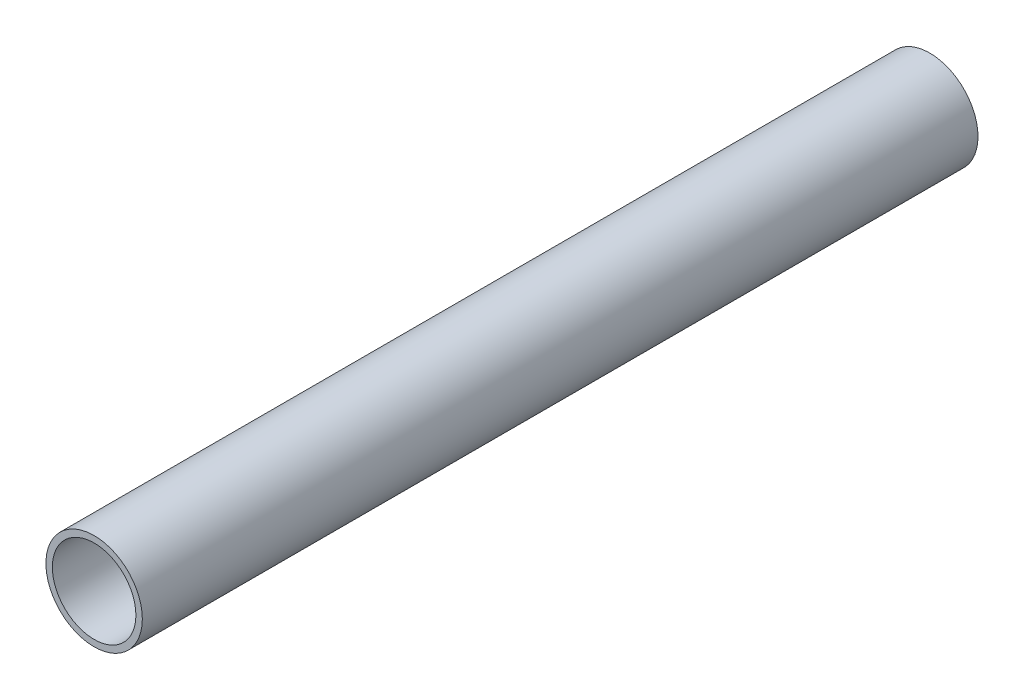
ISO-10303-21;
HEADER;
FILE_DESCRIPTION(('STEP AP214'),'2;1');
FILE_NAME('part.step','',(''),(''),'','','');
FILE_SCHEMA(('AUTOMOTIVE_DESIGN { 1 0 10303 214 1 1 1 1 }'));
ENDSEC;
DATA;
#1=APPLICATION_CONTEXT('core data for automotive mechanical design processes');
#2=APPLICATION_PROTOCOL_DEFINITION('international standard','automotive_design',2000,#1);
#3=PRODUCT_CONTEXT('',#1,'mechanical');
#4=PRODUCT('Part','Part','',(#3));
#5=PRODUCT_RELATED_PRODUCT_CATEGORY('part','',(#4));
#6=PRODUCT_DEFINITION_FORMATION('','',#4);
#7=PRODUCT_DEFINITION_CONTEXT('part definition',#1,'design');
#8=PRODUCT_DEFINITION('design','',#6,#7);
#9=PRODUCT_DEFINITION_SHAPE('','',#8);
#10=(LENGTH_UNIT() NAMED_UNIT(*) SI_UNIT(.MILLI.,.METRE.));
#11=(NAMED_UNIT(*) PLANE_ANGLE_UNIT() SI_UNIT($,.RADIAN.));
#12=(NAMED_UNIT(*) SI_UNIT($,.STERADIAN.) SOLID_ANGLE_UNIT());
#13=UNCERTAINTY_MEASURE_WITH_UNIT(LENGTH_MEASURE(1.E-05),#10,'distance_accuracy_value','');
#14=(GEOMETRIC_REPRESENTATION_CONTEXT(3) GLOBAL_UNCERTAINTY_ASSIGNED_CONTEXT((#13)) GLOBAL_UNIT_ASSIGNED_CONTEXT((#10,
#11,#12)) REPRESENTATION_CONTEXT('',''));
#15=CARTESIAN_POINT('',(0.,0.,0.));
#16=DIRECTION('',(0.,0.,1.));
#17=DIRECTION('',(1.,0.,0.));
#18=AXIS2_PLACEMENT_3D('',#15,#16,#17);
#19=CARTESIAN_POINT('',(0.,0.,260.));
#20=DIRECTION('',(0.,0.,1.));
#21=DIRECTION('',(1.,0.,0.));
#22=AXIS2_PLACEMENT_3D('',#19,#20,#21);
#23=PLANE('',#22);
#24=CARTESIAN_POINT('',(0.,0.,260.));
#25=DIRECTION('',(0.,0.,1.));
#26=DIRECTION('',(1.,0.,0.));
#27=AXIS2_PLACEMENT_3D('',#24,#25,#26);
#28=CIRCLE('',#27,15.);
#29=CARTESIAN_POINT('',(15.,0.,260.));
#30=VERTEX_POINT('',#29);
#31=EDGE_CURVE('E10',#30,#30,#28,.T.);
#32=ORIENTED_EDGE('',*,*,#31,.T.);
#33=EDGE_LOOP('',(#32));
#34=FACE_BOUND('',#33,.T.);
#35=CARTESIAN_POINT('',(0.,0.,260.));
#36=DIRECTION('',(0.,0.,1.));
#37=DIRECTION('',(1.,0.,0.));
#38=AXIS2_PLACEMENT_3D('',#35,#36,#37);
#39=CIRCLE('',#38,13.);
#40=CARTESIAN_POINT('',(13.,0.,260.));
#41=VERTEX_POINT('',#40);
#42=EDGE_CURVE('E45',#41,#41,#39,.T.);
#43=ORIENTED_EDGE('',*,*,#42,.F.);
#44=EDGE_LOOP('',(#43));
#45=FACE_BOUND('',#44,.T.);
#46=ADVANCED_FACE('F34',(#34,#45),#23,.T.);
#47=CARTESIAN_POINT('',(0.,0.,0.));
#48=DIRECTION('',(0.,0.,1.));
#49=DIRECTION('',(1.,0.,0.));
#50=AXIS2_PLACEMENT_3D('',#47,#48,#49);
#51=PLANE('',#50);
#52=CARTESIAN_POINT('',(0.,0.,0.));
#53=DIRECTION('',(0.,0.,1.));
#54=DIRECTION('',(1.,0.,0.));
#55=AXIS2_PLACEMENT_3D('',#52,#53,#54);
#56=CIRCLE('',#55,15.);
#57=CARTESIAN_POINT('',(15.,0.,0.));
#58=VERTEX_POINT('',#57);
#59=EDGE_CURVE('E38',#58,#58,#56,.T.);
#60=ORIENTED_EDGE('',*,*,#59,.F.);
#61=EDGE_LOOP('',(#60));
#62=FACE_BOUND('',#61,.T.);
#63=CARTESIAN_POINT('',(0.,0.,0.));
#64=DIRECTION('',(0.,0.,1.));
#65=DIRECTION('',(1.,0.,0.));
#66=AXIS2_PLACEMENT_3D('',#63,#64,#65);
#67=CIRCLE('',#66,13.);
#68=CARTESIAN_POINT('',(13.,0.,0.));
#69=VERTEX_POINT('',#68);
#70=EDGE_CURVE('E47',#69,#69,#67,.T.);
#71=ORIENTED_EDGE('',*,*,#70,.T.);
#72=EDGE_LOOP('',(#71));
#73=FACE_BOUND('',#72,.T.);
#74=ADVANCED_FACE('F57',(#62,#73),#51,.F.);
#75=CARTESIAN_POINT('',(0.,0.,260.));
#76=DIRECTION('',(0.,0.,-1.));
#77=DIRECTION('',(-1.,0.,0.));
#78=AXIS2_PLACEMENT_3D('',#75,#76,#77);
#79=CYLINDRICAL_SURFACE('',#78,15.);
#80=ORIENTED_EDGE('',*,*,#31,.F.);
#81=EDGE_LOOP('',(#80));
#82=FACE_BOUND('',#81,.T.);
#83=ORIENTED_EDGE('',*,*,#59,.T.);
#84=EDGE_LOOP('',(#83));
#85=FACE_BOUND('',#84,.T.);
#86=ADVANCED_FACE('F36',(#82,#85),#79,.T.);
#87=CARTESIAN_POINT('',(0.,0.,260.));
#88=DIRECTION('',(0.,0.,-1.));
#89=DIRECTION('',(-1.,0.,0.));
#90=AXIS2_PLACEMENT_3D('',#87,#88,#89);
#91=CYLINDRICAL_SURFACE('',#90,13.);
#92=ORIENTED_EDGE('',*,*,#42,.T.);
#93=EDGE_LOOP('',(#92));
#94=FACE_BOUND('',#93,.T.);
#95=ORIENTED_EDGE('',*,*,#70,.F.);
#96=EDGE_LOOP('',(#95));
#97=FACE_BOUND('',#96,.T.);
#98=ADVANCED_FACE('F53',(#94,#97),#91,.F.);
#99=CLOSED_SHELL('',(#46,#74,#86,#98));
#100=MANIFOLD_SOLID_BREP('B2',#99);
#101=ADVANCED_BREP_SHAPE_REPRESENTATION('',(#18,#100),#14);
#102=SHAPE_DEFINITION_REPRESENTATION(#9,#101);
ENDSEC;
END-ISO-10303-21;
